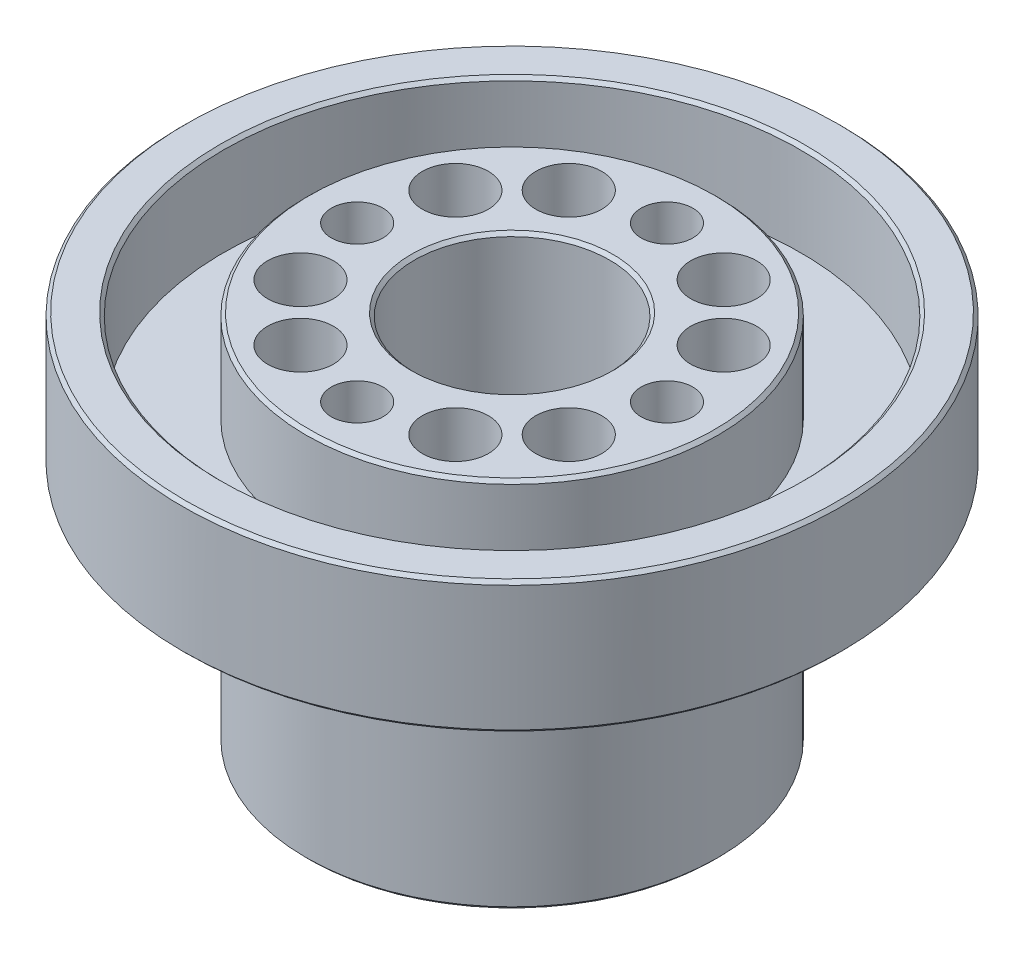
ISO-10303-21;
HEADER;
FILE_DESCRIPTION(('STEP AP214'),'2;1');
FILE_NAME('part.step','',(''),(''),'','','');
FILE_SCHEMA(('AUTOMOTIVE_DESIGN { 1 0 10303 214 1 1 1 1 }'));
ENDSEC;
DATA;
#1=APPLICATION_CONTEXT('core data for automotive mechanical design processes');
#2=APPLICATION_PROTOCOL_DEFINITION('international standard','automotive_design',2000,#1);
#3=PRODUCT_CONTEXT('',#1,'mechanical');
#4=PRODUCT('Part','Part','',(#3));
#5=PRODUCT_RELATED_PRODUCT_CATEGORY('part','',(#4));
#6=PRODUCT_DEFINITION_FORMATION('','',#4);
#7=PRODUCT_DEFINITION_CONTEXT('part definition',#1,'design');
#8=PRODUCT_DEFINITION('design','',#6,#7);
#9=PRODUCT_DEFINITION_SHAPE('','',#8);
#10=(LENGTH_UNIT() NAMED_UNIT(*) SI_UNIT(.MILLI.,.METRE.));
#11=(NAMED_UNIT(*) PLANE_ANGLE_UNIT() SI_UNIT($,.RADIAN.));
#12=(NAMED_UNIT(*) SI_UNIT($,.STERADIAN.) SOLID_ANGLE_UNIT());
#13=UNCERTAINTY_MEASURE_WITH_UNIT(LENGTH_MEASURE(1.E-05),#10,'distance_accuracy_value','');
#14=(GEOMETRIC_REPRESENTATION_CONTEXT(3) GLOBAL_UNCERTAINTY_ASSIGNED_CONTEXT((#13)) GLOBAL_UNIT_ASSIGNED_CONTEXT((#10,
#11,#12)) REPRESENTATION_CONTEXT('',''));
#15=CARTESIAN_POINT('',(0.,0.,0.));
#16=DIRECTION('',(0.,0.,1.));
#17=DIRECTION('',(1.,0.,0.));
#18=AXIS2_PLACEMENT_3D('',#15,#16,#17);
#19=CARTESIAN_POINT('',(0.,16.51,0.));
#20=DIRECTION('',(0.,1.,0.));
#21=DIRECTION('',(0.,0.,1.));
#22=AXIS2_PLACEMENT_3D('',#19,#20,#21);
#23=PLANE('',#22);
#24=CARTESIAN_POINT('',(0.,16.51,0.));
#25=DIRECTION('',(0.,1.,0.));
#26=DIRECTION('',(0.,0.,1.));
#27=AXIS2_PLACEMENT_3D('',#24,#25,#26);
#28=CIRCLE('',#27,7.5184);
#29=CARTESIAN_POINT('',(0.,16.51,7.5184));
#30=VERTEX_POINT('',#29);
#31=EDGE_CURVE('E145',#30,#30,#28,.T.);
#32=ORIENTED_EDGE('',*,*,#31,.T.);
#33=EDGE_LOOP('',(#32));
#34=FACE_BOUND('',#33,.T.);
#35=CARTESIAN_POINT('',(0.,16.51,0.));
#36=DIRECTION('',(0.,-1.,0.));
#37=DIRECTION('',(0.,0.,-1.));
#38=AXIS2_PLACEMENT_3D('',#35,#36,#37);
#39=CIRCLE('',#38,6.985);
#40=CARTESIAN_POINT('',(0.,16.51,-6.985));
#41=VERTEX_POINT('',#40);
#42=EDGE_CURVE('E18',#41,#41,#39,.T.);
#43=ORIENTED_EDGE('',*,*,#42,.T.);
#44=EDGE_LOOP('',(#43));
#45=FACE_BOUND('',#44,.T.);
#46=ADVANCED_FACE('F15',(#34,#45),#23,.T.);
#47=CARTESIAN_POINT('',(0.,28.702,0.));
#48=DIRECTION('',(0.,-1.,0.));
#49=DIRECTION('',(0.,0.,-1.));
#50=AXIS2_PLACEMENT_3D('',#47,#48,#49);
#51=CYLINDRICAL_SURFACE('',#50,6.985);
#52=CARTESIAN_POINT('',(0.,3.048,0.));
#53=DIRECTION('',(0.,-1.,0.));
#54=DIRECTION('',(0.,0.,-1.));
#55=AXIS2_PLACEMENT_3D('',#52,#53,#54);
#56=CIRCLE('',#55,6.985);
#57=CARTESIAN_POINT('',(0.,3.048,-6.985));
#58=VERTEX_POINT('',#57);
#59=EDGE_CURVE('E143',#58,#58,#56,.F.);
#60=ORIENTED_EDGE('',*,*,#59,.F.);
#61=EDGE_LOOP('',(#60));
#62=FACE_BOUND('',#61,.T.);
#63=ORIENTED_EDGE('',*,*,#42,.F.);
#64=EDGE_LOOP('',(#63));
#65=FACE_BOUND('',#64,.T.);
#66=ADVANCED_FACE('F153',(#62,#65),#51,.F.);
#67=CARTESIAN_POINT('',(0.,16.51,0.));
#68=DIRECTION('',(0.,1.,0.));
#69=DIRECTION('',(0.,0.,1.));
#70=AXIS2_PLACEMENT_3D('',#67,#68,#69);
#71=CYLINDRICAL_SURFACE('',#70,7.5184);
#72=ORIENTED_EDGE('',*,*,#31,.F.);
#73=EDGE_LOOP('',(#72));
#74=FACE_BOUND('',#73,.T.);
#75=CARTESIAN_POINT('',(0.,28.448,0.));
#76=DIRECTION('',(0.,1.,0.));
#77=DIRECTION('',(0.,0.,1.));
#78=AXIS2_PLACEMENT_3D('',#75,#76,#77);
#79=CIRCLE('',#78,7.5184);
#80=CARTESIAN_POINT('',(0.,28.448,7.5184));
#81=VERTEX_POINT('',#80);
#82=EDGE_CURVE('E142',#81,#81,#79,.T.);
#83=ORIENTED_EDGE('',*,*,#82,.T.);
#84=EDGE_LOOP('',(#83));
#85=FACE_BOUND('',#84,.T.);
#86=ADVANCED_FACE('F155',(#74,#85),#71,.F.);
#87=CARTESIAN_POINT('',(0.,21.59,0.));
#88=DIRECTION('',(0.,1.,0.));
#89=DIRECTION('',(0.,0.,1.));
#90=AXIS2_PLACEMENT_3D('',#87,#88,#89);
#91=CYLINDRICAL_SURFACE('',#90,15.875);
#92=CARTESIAN_POINT('',(0.,21.59,0.));
#93=DIRECTION('',(0.,1.,0.));
#94=DIRECTION('',(0.,0.,1.));
#95=AXIS2_PLACEMENT_3D('',#92,#93,#94);
#96=CIRCLE('',#95,15.875);
#97=CARTESIAN_POINT('',(0.,21.59,15.875));
#98=VERTEX_POINT('',#97);
#99=EDGE_CURVE('E139',#98,#98,#96,.F.);
#100=ORIENTED_EDGE('',*,*,#99,.F.);
#101=EDGE_LOOP('',(#100));
#102=FACE_BOUND('',#101,.T.);
#103=CARTESIAN_POINT('',(0.,28.448,0.));
#104=DIRECTION('',(0.,-1.,0.));
#105=DIRECTION('',(0.,0.,-1.));
#106=AXIS2_PLACEMENT_3D('',#103,#104,#105);
#107=CIRCLE('',#106,15.875);
#108=CARTESIAN_POINT('',(0.,28.448,-15.875));
#109=VERTEX_POINT('',#108);
#110=EDGE_CURVE('E30',#109,#109,#107,.F.);
#111=ORIENTED_EDGE('',*,*,#110,.F.);
#112=EDGE_LOOP('',(#111));
#113=FACE_BOUND('',#112,.T.);
#114=ADVANCED_FACE('F162',(#102,#113),#91,.T.);
#115=CARTESIAN_POINT('',(0.,3.048,0.));
#116=DIRECTION('',(0.,-1.,0.));
#117=DIRECTION('',(0.,0.,-1.));
#118=AXIS2_PLACEMENT_3D('',#115,#116,#117);
#119=PLANE('',#118);
#120=CARTESIAN_POINT('',(0.,3.048,0.));
#121=DIRECTION('',(0.,-1.,0.));
#122=DIRECTION('',(0.,0.,-1.));
#123=AXIS2_PLACEMENT_3D('',#120,#121,#122);
#124=CIRCLE('',#123,7.5184);
#125=CARTESIAN_POINT('',(0.,3.048,-7.5184));
#126=VERTEX_POINT('',#125);
#127=EDGE_CURVE('E136',#126,#126,#124,.T.);
#128=ORIENTED_EDGE('',*,*,#127,.T.);
#129=EDGE_LOOP('',(#128));
#130=FACE_BOUND('',#129,.T.);
#131=ORIENTED_EDGE('',*,*,#59,.T.);
#132=EDGE_LOOP('',(#131));
#133=FACE_BOUND('',#132,.T.);
#134=ADVANCED_FACE('F288',(#130,#133),#119,.T.);
#135=CARTESIAN_POINT('',(0.,28.448,0.));
#136=DIRECTION('',(0.,-1.,0.));
#137=DIRECTION('',(0.,0.,-1.));
#138=AXIS2_PLACEMENT_3D('',#135,#136,#137);
#139=CONICAL_SURFACE('',#138,15.875,0.785398163397448);
#140=ORIENTED_EDGE('',*,*,#110,.T.);
#141=EDGE_LOOP('',(#140));
#142=FACE_BOUND('',#141,.T.);
#143=CARTESIAN_POINT('',(0.,28.702,0.));
#144=DIRECTION('',(0.,-1.,0.));
#145=DIRECTION('',(0.,0.,-1.));
#146=AXIS2_PLACEMENT_3D('',#143,#144,#145);
#147=CIRCLE('',#146,15.621);
#148=CARTESIAN_POINT('',(0.,28.702,-15.621));
#149=VERTEX_POINT('',#148);
#150=EDGE_CURVE('E133',#149,#149,#147,.F.);
#151=ORIENTED_EDGE('',*,*,#150,.F.);
#152=EDGE_LOOP('',(#151));
#153=FACE_BOUND('',#152,.T.);
#154=ADVANCED_FACE('F284',(#142,#153),#139,.T.);
#155=CARTESIAN_POINT('',(0.,28.702,0.));
#156=DIRECTION('',(0.,1.,0.));
#157=DIRECTION('',(0.,0.,1.));
#158=AXIS2_PLACEMENT_3D('',#155,#156,#157);
#159=CONICAL_SURFACE('',#158,7.77240000000003,0.785398163397442);
#160=ORIENTED_EDGE('',*,*,#82,.F.);
#161=EDGE_LOOP('',(#160));
#162=FACE_BOUND('',#161,.T.);
#163=CARTESIAN_POINT('',(0.,28.702,0.));
#164=DIRECTION('',(0.,1.,0.));
#165=DIRECTION('',(0.,0.,1.));
#166=AXIS2_PLACEMENT_3D('',#163,#164,#165);
#167=CIRCLE('',#166,7.77240000000003);
#168=CARTESIAN_POINT('',(0.,28.702,7.77240000000003));
#169=VERTEX_POINT('',#168);
#170=EDGE_CURVE('E130',#169,#169,#167,.F.);
#171=ORIENTED_EDGE('',*,*,#170,.F.);
#172=EDGE_LOOP('',(#171));
#173=FACE_BOUND('',#172,.T.);
#174=ADVANCED_FACE('F280',(#162,#173),#159,.F.);
#175=CARTESIAN_POINT('',(0.,21.59,0.));
#176=DIRECTION('',(0.,1.,0.));
#177=DIRECTION('',(0.,0.,1.));
#178=AXIS2_PLACEMENT_3D('',#175,#176,#177);
#179=PLANE('',#178);
#180=CARTESIAN_POINT('',(0.,21.59,0.));
#181=DIRECTION('',(0.,1.,0.));
#182=DIRECTION('',(0.,0.,1.));
#183=AXIS2_PLACEMENT_3D('',#180,#181,#182);
#184=CIRCLE('',#183,22.225);
#185=CARTESIAN_POINT('',(0.,21.59,22.225));
#186=VERTEX_POINT('',#185);
#187=EDGE_CURVE('E127',#186,#186,#184,.T.);
#188=ORIENTED_EDGE('',*,*,#187,.T.);
#189=EDGE_LOOP('',(#188));
#190=FACE_BOUND('',#189,.T.);
#191=ORIENTED_EDGE('',*,*,#99,.T.);
#192=EDGE_LOOP('',(#191));
#193=FACE_BOUND('',#192,.T.);
#194=ADVANCED_FACE('F276',(#190,#193),#179,.T.);
#195=CARTESIAN_POINT('',(0.,3.048,0.));
#196=DIRECTION('',(0.,-1.,0.));
#197=DIRECTION('',(0.,0.,-1.));
#198=AXIS2_PLACEMENT_3D('',#195,#196,#197);
#199=CYLINDRICAL_SURFACE('',#198,7.5184);
#200=CARTESIAN_POINT('',(0.,0.254000000000031,0.));
#201=DIRECTION('',(0.,-1.,0.));
#202=DIRECTION('',(0.,0.,-1.));
#203=AXIS2_PLACEMENT_3D('',#200,#201,#202);
#204=CIRCLE('',#203,7.5184);
#205=CARTESIAN_POINT('',(0.,0.254000000000031,-7.5184));
#206=VERTEX_POINT('',#205);
#207=EDGE_CURVE('E102',#206,#206,#204,.T.);
#208=ORIENTED_EDGE('',*,*,#207,.T.);
#209=EDGE_LOOP('',(#208));
#210=FACE_BOUND('',#209,.T.);
#211=ORIENTED_EDGE('',*,*,#127,.F.);
#212=EDGE_LOOP('',(#211));
#213=FACE_BOUND('',#212,.T.);
#214=ADVANCED_FACE('F272',(#210,#213),#199,.F.);
#215=CARTESIAN_POINT('',(0.,28.702,0.));
#216=DIRECTION('',(0.,1.,0.));
#217=DIRECTION('',(0.,0.,1.));
#218=AXIS2_PLACEMENT_3D('',#215,#216,#217);
#219=PLANE('',#218);
#220=CARTESIAN_POINT('',(-10.3386112703787,28.702,5.96899999999994));
#221=DIRECTION('',(0.,-1.,0.));
#222=DIRECTION('',(0.,0.,-1.));
#223=AXIS2_PLACEMENT_3D('',#220,#221,#222);
#224=CIRCLE('',#223,2.54);
#225=CARTESIAN_POINT('',(-10.3386112703787,28.702,3.42899999999993));
#226=VERTEX_POINT('',#225);
#227=EDGE_CURVE('E124',#226,#226,#224,.T.);
#228=ORIENTED_EDGE('',*,*,#227,.T.);
#229=EDGE_LOOP('',(#228));
#230=FACE_BOUND('',#229,.T.);
#231=CARTESIAN_POINT('',(-5.96900000000012,28.702,10.3386112703786));
#232=DIRECTION('',(0.,-1.,0.));
#233=DIRECTION('',(0.,0.,-1.));
#234=AXIS2_PLACEMENT_3D('',#231,#232,#233);
#235=CIRCLE('',#234,2.54);
#236=CARTESIAN_POINT('',(-5.96900000000012,28.702,7.79861127037856));
#237=VERTEX_POINT('',#236);
#238=EDGE_CURVE('E121',#237,#237,#235,.T.);
#239=ORIENTED_EDGE('',*,*,#238,.T.);
#240=EDGE_LOOP('',(#239));
#241=FACE_BOUND('',#240,.T.);
#242=CARTESIAN_POINT('',(5.96900000000004,28.702,10.3386112703786));
#243=DIRECTION('',(0.,-1.,0.));
#244=DIRECTION('',(0.,0.,-1.));
#245=AXIS2_PLACEMENT_3D('',#242,#243,#244);
#246=CIRCLE('',#245,2.54);
#247=CARTESIAN_POINT('',(5.96900000000004,28.702,7.7986112703786));
#248=VERTEX_POINT('',#247);
#249=EDGE_CURVE('E118',#248,#248,#246,.T.);
#250=ORIENTED_EDGE('',*,*,#249,.T.);
#251=EDGE_LOOP('',(#250));
#252=FACE_BOUND('',#251,.T.);
#253=CARTESIAN_POINT('',(10.3386112703786,28.702,5.96900000000002));
#254=DIRECTION('',(0.,-1.,0.));
#255=DIRECTION('',(0.,0.,-1.));
#256=AXIS2_PLACEMENT_3D('',#253,#254,#255);
#257=CIRCLE('',#256,2.54);
#258=CARTESIAN_POINT('',(10.3386112703786,28.702,3.42900000000001));
#259=VERTEX_POINT('',#258);
#260=EDGE_CURVE('E115',#259,#259,#257,.T.);
#261=ORIENTED_EDGE('',*,*,#260,.T.);
#262=EDGE_LOOP('',(#261));
#263=FACE_BOUND('',#262,.T.);
#264=CARTESIAN_POINT('',(10.3386112703786,28.702,-5.96900000000001));
#265=DIRECTION('',(0.,-1.,0.));
#266=DIRECTION('',(0.,0.,-1.));
#267=AXIS2_PLACEMENT_3D('',#264,#265,#266);
#268=CIRCLE('',#267,2.54);
#269=CARTESIAN_POINT('',(10.3386112703786,28.702,-8.50900000000001));
#270=VERTEX_POINT('',#269);
#271=EDGE_CURVE('E112',#270,#270,#268,.T.);
#272=ORIENTED_EDGE('',*,*,#271,.T.);
#273=EDGE_LOOP('',(#272));
#274=FACE_BOUND('',#273,.T.);
#275=CARTESIAN_POINT('',(5.96900000000005,28.702,-10.3386112703786));
#276=DIRECTION('',(0.,-1.,0.));
#277=DIRECTION('',(0.,0.,-1.));
#278=AXIS2_PLACEMENT_3D('',#275,#276,#277);
#279=CIRCLE('',#278,2.54);
#280=CARTESIAN_POINT('',(5.96900000000005,28.702,-12.8786112703786));
#281=VERTEX_POINT('',#280);
#282=EDGE_CURVE('E109',#281,#281,#279,.T.);
#283=ORIENTED_EDGE('',*,*,#282,.T.);
#284=EDGE_LOOP('',(#283));
#285=FACE_BOUND('',#284,.T.);
#286=CARTESIAN_POINT('',(-5.96900000000004,28.702,-10.3386112703786));
#287=DIRECTION('',(0.,-1.,0.));
#288=DIRECTION('',(0.,0.,-1.));
#289=AXIS2_PLACEMENT_3D('',#286,#287,#288);
#290=CIRCLE('',#289,2.54);
#291=CARTESIAN_POINT('',(-5.96900000000004,28.702,-12.8786112703786));
#292=VERTEX_POINT('',#291);
#293=EDGE_CURVE('E106',#292,#292,#290,.T.);
#294=ORIENTED_EDGE('',*,*,#293,.T.);
#295=EDGE_LOOP('',(#294));
#296=FACE_BOUND('',#295,.T.);
#297=CARTESIAN_POINT('',(-10.3386112703786,28.702,-5.96900000000002));
#298=DIRECTION('',(0.,-1.,0.));
#299=DIRECTION('',(0.,0.,-1.));
#300=AXIS2_PLACEMENT_3D('',#297,#298,#299);
#301=CIRCLE('',#300,2.54);
#302=CARTESIAN_POINT('',(-10.3386112703786,28.702,-8.50900000000002));
#303=VERTEX_POINT('',#302);
#304=EDGE_CURVE('E103',#303,#303,#301,.T.);
#305=ORIENTED_EDGE('',*,*,#304,.T.);
#306=EDGE_LOOP('',(#305));
#307=FACE_BOUND('',#306,.T.);
#308=ORIENTED_EDGE('',*,*,#170,.T.);
#309=EDGE_LOOP('',(#308));
#310=FACE_BOUND('',#309,.T.);
#311=CARTESIAN_POINT('',(-11.938,28.702,-1.25043912669328E-13));
#312=DIRECTION('',(0.,1.,0.));
#313=DIRECTION('',(0.,0.,1.));
#314=AXIS2_PLACEMENT_3D('',#311,#312,#313);
#315=CIRCLE('',#314,1.9939);
#316=CARTESIAN_POINT('',(-11.938,28.702,1.99389999999988));
#317=VERTEX_POINT('',#316);
#318=EDGE_CURVE('E90',#317,#317,#315,.F.);
#319=ORIENTED_EDGE('',*,*,#318,.T.);
#320=EDGE_LOOP('',(#319));
#321=FACE_BOUND('',#320,.T.);
#322=CARTESIAN_POINT('',(0.,28.702,11.938));
#323=DIRECTION('',(0.,1.,0.));
#324=DIRECTION('',(0.,0.,1.));
#325=AXIS2_PLACEMENT_3D('',#322,#323,#324);
#326=CIRCLE('',#325,1.9939);
#327=CARTESIAN_POINT('',(0.,28.702,13.9319));
#328=VERTEX_POINT('',#327);
#329=EDGE_CURVE('E93',#328,#328,#326,.F.);
#330=ORIENTED_EDGE('',*,*,#329,.T.);
#331=EDGE_LOOP('',(#330));
#332=FACE_BOUND('',#331,.T.);
#333=CARTESIAN_POINT('',(11.938,28.702,0.));
#334=DIRECTION('',(0.,1.,0.));
#335=DIRECTION('',(0.,0.,1.));
#336=AXIS2_PLACEMENT_3D('',#333,#334,#335);
#337=CIRCLE('',#336,1.9939);
#338=CARTESIAN_POINT('',(11.938,28.702,1.99390000000004));
#339=VERTEX_POINT('',#338);
#340=EDGE_CURVE('E96',#339,#339,#337,.F.);
#341=ORIENTED_EDGE('',*,*,#340,.T.);
#342=EDGE_LOOP('',(#341));
#343=FACE_BOUND('',#342,.T.);
#344=CARTESIAN_POINT('',(0.,28.702,-11.938));
#345=DIRECTION('',(0.,1.,0.));
#346=DIRECTION('',(0.,0.,1.));
#347=AXIS2_PLACEMENT_3D('',#344,#345,#346);
#348=CIRCLE('',#347,1.9939);
#349=CARTESIAN_POINT('',(0.,28.702,-9.9441));
#350=VERTEX_POINT('',#349);
#351=EDGE_CURVE('E99',#350,#350,#348,.F.);
#352=ORIENTED_EDGE('',*,*,#351,.T.);
#353=EDGE_LOOP('',(#352));
#354=FACE_BOUND('',#353,.T.);
#355=ORIENTED_EDGE('',*,*,#150,.T.);
#356=EDGE_LOOP('',(#355));
#357=FACE_BOUND('',#356,.T.);
#358=ADVANCED_FACE('F268',(#230,#241,#252,#263,#274,#285,#296,#307,#310,#321,#332,#343,#354,
#357),#219,.T.);
#359=CARTESIAN_POINT('',(0.,21.59,0.));
#360=DIRECTION('',(0.,1.,0.));
#361=DIRECTION('',(0.,0.,1.));
#362=AXIS2_PLACEMENT_3D('',#359,#360,#361);
#363=CYLINDRICAL_SURFACE('',#362,22.225);
#364=ORIENTED_EDGE('',*,*,#187,.F.);
#365=EDGE_LOOP('',(#364));
#366=FACE_BOUND('',#365,.T.);
#367=CARTESIAN_POINT('',(0.,28.448,0.));
#368=DIRECTION('',(0.,1.,0.));
#369=DIRECTION('',(0.,0.,1.));
#370=AXIS2_PLACEMENT_3D('',#367,#368,#369);
#371=CIRCLE('',#370,22.225);
#372=CARTESIAN_POINT('',(0.,28.448,22.225));
#373=VERTEX_POINT('',#372);
#374=EDGE_CURVE('E89',#373,#373,#371,.T.);
#375=ORIENTED_EDGE('',*,*,#374,.T.);
#376=EDGE_LOOP('',(#375));
#377=FACE_BOUND('',#376,.T.);
#378=ADVANCED_FACE('F264',(#366,#377),#363,.F.);
#379=CARTESIAN_POINT('',(-10.3386112703787,28.702,5.96899999999994));
#380=DIRECTION('',(0.,-1.,0.));
#381=DIRECTION('',(0.,0.,-1.));
#382=AXIS2_PLACEMENT_3D('',#379,#380,#381);
#383=CYLINDRICAL_SURFACE('',#382,2.54);
#384=ORIENTED_EDGE('',*,*,#227,.F.);
#385=EDGE_LOOP('',(#384));
#386=FACE_BOUND('',#385,.T.);
#387=CARTESIAN_POINT('',(-10.3386112703787,0.,5.96899999999994));
#388=DIRECTION('',(0.,-1.,0.));
#389=DIRECTION('',(0.,0.,-1.));
#390=AXIS2_PLACEMENT_3D('',#387,#388,#389);
#391=CIRCLE('',#390,2.54);
#392=CARTESIAN_POINT('',(-10.3386112703787,0.,3.42899999999993));
#393=VERTEX_POINT('',#392);
#394=EDGE_CURVE('E86',#393,#393,#391,.T.);
#395=ORIENTED_EDGE('',*,*,#394,.T.);
#396=EDGE_LOOP('',(#395));
#397=FACE_BOUND('',#396,.T.);
#398=ADVANCED_FACE('F260',(#386,#397),#383,.F.);
#399=CARTESIAN_POINT('',(-5.96900000000012,28.702,10.3386112703786));
#400=DIRECTION('',(0.,-1.,0.));
#401=DIRECTION('',(0.,0.,-1.));
#402=AXIS2_PLACEMENT_3D('',#399,#400,#401);
#403=CYLINDRICAL_SURFACE('',#402,2.54);
#404=ORIENTED_EDGE('',*,*,#238,.F.);
#405=EDGE_LOOP('',(#404));
#406=FACE_BOUND('',#405,.T.);
#407=CARTESIAN_POINT('',(-5.96900000000012,0.,10.3386112703786));
#408=DIRECTION('',(0.,-1.,0.));
#409=DIRECTION('',(0.,0.,-1.));
#410=AXIS2_PLACEMENT_3D('',#407,#408,#409);
#411=CIRCLE('',#410,2.54);
#412=CARTESIAN_POINT('',(-5.96900000000012,0.,7.79861127037856));
#413=VERTEX_POINT('',#412);
#414=EDGE_CURVE('E83',#413,#413,#411,.T.);
#415=ORIENTED_EDGE('',*,*,#414,.T.);
#416=EDGE_LOOP('',(#415));
#417=FACE_BOUND('',#416,.T.);
#418=ADVANCED_FACE('F256',(#406,#417),#403,.F.);
#419=CARTESIAN_POINT('',(5.96900000000004,28.702,10.3386112703786));
#420=DIRECTION('',(0.,-1.,0.));
#421=DIRECTION('',(0.,0.,-1.));
#422=AXIS2_PLACEMENT_3D('',#419,#420,#421);
#423=CYLINDRICAL_SURFACE('',#422,2.54);
#424=ORIENTED_EDGE('',*,*,#249,.F.);
#425=EDGE_LOOP('',(#424));
#426=FACE_BOUND('',#425,.T.);
#427=CARTESIAN_POINT('',(5.96900000000004,0.,10.3386112703786));
#428=DIRECTION('',(0.,-1.,0.));
#429=DIRECTION('',(0.,0.,-1.));
#430=AXIS2_PLACEMENT_3D('',#427,#428,#429);
#431=CIRCLE('',#430,2.54);
#432=CARTESIAN_POINT('',(5.96900000000004,0.,7.7986112703786));
#433=VERTEX_POINT('',#432);
#434=EDGE_CURVE('E80',#433,#433,#431,.T.);
#435=ORIENTED_EDGE('',*,*,#434,.T.);
#436=EDGE_LOOP('',(#435));
#437=FACE_BOUND('',#436,.T.);
#438=ADVANCED_FACE('F252',(#426,#437),#423,.F.);
#439=CARTESIAN_POINT('',(10.3386112703786,28.702,5.96900000000002));
#440=DIRECTION('',(0.,-1.,0.));
#441=DIRECTION('',(0.,0.,-1.));
#442=AXIS2_PLACEMENT_3D('',#439,#440,#441);
#443=CYLINDRICAL_SURFACE('',#442,2.54);
#444=ORIENTED_EDGE('',*,*,#260,.F.);
#445=EDGE_LOOP('',(#444));
#446=FACE_BOUND('',#445,.T.);
#447=CARTESIAN_POINT('',(10.3386112703786,0.,5.96900000000002));
#448=DIRECTION('',(0.,-1.,0.));
#449=DIRECTION('',(0.,0.,-1.));
#450=AXIS2_PLACEMENT_3D('',#447,#448,#449);
#451=CIRCLE('',#450,2.54);
#452=CARTESIAN_POINT('',(10.3386112703786,0.,3.42900000000001));
#453=VERTEX_POINT('',#452);
#454=EDGE_CURVE('E77',#453,#453,#451,.T.);
#455=ORIENTED_EDGE('',*,*,#454,.T.);
#456=EDGE_LOOP('',(#455));
#457=FACE_BOUND('',#456,.T.);
#458=ADVANCED_FACE('F248',(#446,#457),#443,.F.);
#459=CARTESIAN_POINT('',(10.3386112703786,28.702,-5.96900000000001));
#460=DIRECTION('',(0.,-1.,0.));
#461=DIRECTION('',(0.,0.,-1.));
#462=AXIS2_PLACEMENT_3D('',#459,#460,#461);
#463=CYLINDRICAL_SURFACE('',#462,2.54);
#464=ORIENTED_EDGE('',*,*,#271,.F.);
#465=EDGE_LOOP('',(#464));
#466=FACE_BOUND('',#465,.T.);
#467=CARTESIAN_POINT('',(10.3386112703786,0.,-5.96900000000001));
#468=DIRECTION('',(0.,-1.,0.));
#469=DIRECTION('',(0.,0.,-1.));
#470=AXIS2_PLACEMENT_3D('',#467,#468,#469);
#471=CIRCLE('',#470,2.54);
#472=CARTESIAN_POINT('',(10.3386112703786,0.,-8.50900000000001));
#473=VERTEX_POINT('',#472);
#474=EDGE_CURVE('E74',#473,#473,#471,.T.);
#475=ORIENTED_EDGE('',*,*,#474,.T.);
#476=EDGE_LOOP('',(#475));
#477=FACE_BOUND('',#476,.T.);
#478=ADVANCED_FACE('F244',(#466,#477),#463,.F.);
#479=CARTESIAN_POINT('',(5.96900000000005,28.702,-10.3386112703786));
#480=DIRECTION('',(0.,-1.,0.));
#481=DIRECTION('',(0.,0.,-1.));
#482=AXIS2_PLACEMENT_3D('',#479,#480,#481);
#483=CYLINDRICAL_SURFACE('',#482,2.54);
#484=ORIENTED_EDGE('',*,*,#282,.F.);
#485=EDGE_LOOP('',(#484));
#486=FACE_BOUND('',#485,.T.);
#487=CARTESIAN_POINT('',(5.96900000000005,0.,-10.3386112703786));
#488=DIRECTION('',(0.,-1.,0.));
#489=DIRECTION('',(0.,0.,-1.));
#490=AXIS2_PLACEMENT_3D('',#487,#488,#489);
#491=CIRCLE('',#490,2.54);
#492=CARTESIAN_POINT('',(5.96900000000005,0.,-12.8786112703786));
#493=VERTEX_POINT('',#492);
#494=EDGE_CURVE('E71',#493,#493,#491,.T.);
#495=ORIENTED_EDGE('',*,*,#494,.T.);
#496=EDGE_LOOP('',(#495));
#497=FACE_BOUND('',#496,.T.);
#498=ADVANCED_FACE('F240',(#486,#497),#483,.F.);
#499=CARTESIAN_POINT('',(-5.96900000000004,28.702,-10.3386112703786));
#500=DIRECTION('',(0.,-1.,0.));
#501=DIRECTION('',(0.,0.,-1.));
#502=AXIS2_PLACEMENT_3D('',#499,#500,#501);
#503=CYLINDRICAL_SURFACE('',#502,2.54);
#504=ORIENTED_EDGE('',*,*,#293,.F.);
#505=EDGE_LOOP('',(#504));
#506=FACE_BOUND('',#505,.T.);
#507=CARTESIAN_POINT('',(-5.96900000000004,0.,-10.3386112703786));
#508=DIRECTION('',(0.,-1.,0.));
#509=DIRECTION('',(0.,0.,-1.));
#510=AXIS2_PLACEMENT_3D('',#507,#508,#509);
#511=CIRCLE('',#510,2.54);
#512=CARTESIAN_POINT('',(-5.96900000000004,0.,-12.8786112703786));
#513=VERTEX_POINT('',#512);
#514=EDGE_CURVE('E68',#513,#513,#511,.T.);
#515=ORIENTED_EDGE('',*,*,#514,.T.);
#516=EDGE_LOOP('',(#515));
#517=FACE_BOUND('',#516,.T.);
#518=ADVANCED_FACE('F236',(#506,#517),#503,.F.);
#519=CARTESIAN_POINT('',(-10.3386112703786,28.702,-5.96900000000002));
#520=DIRECTION('',(0.,-1.,0.));
#521=DIRECTION('',(0.,0.,-1.));
#522=AXIS2_PLACEMENT_3D('',#519,#520,#521);
#523=CYLINDRICAL_SURFACE('',#522,2.54);
#524=ORIENTED_EDGE('',*,*,#304,.F.);
#525=EDGE_LOOP('',(#524));
#526=FACE_BOUND('',#525,.T.);
#527=CARTESIAN_POINT('',(-10.3386112703786,0.,-5.96900000000002));
#528=DIRECTION('',(0.,-1.,0.));
#529=DIRECTION('',(0.,0.,-1.));
#530=AXIS2_PLACEMENT_3D('',#527,#528,#529);
#531=CIRCLE('',#530,2.54);
#532=CARTESIAN_POINT('',(-10.3386112703786,0.,-8.50900000000002));
#533=VERTEX_POINT('',#532);
#534=EDGE_CURVE('E65',#533,#533,#531,.T.);
#535=ORIENTED_EDGE('',*,*,#534,.T.);
#536=EDGE_LOOP('',(#535));
#537=FACE_BOUND('',#536,.T.);
#538=ADVANCED_FACE('F232',(#526,#537),#523,.F.);
#539=CARTESIAN_POINT('',(0.,0.,0.));
#540=DIRECTION('',(0.,-1.,0.));
#541=DIRECTION('',(0.,0.,-1.));
#542=AXIS2_PLACEMENT_3D('',#539,#540,#541);
#543=CONICAL_SURFACE('',#542,7.77240000000003,0.785398163397448);
#544=CARTESIAN_POINT('',(0.,0.,0.));
#545=DIRECTION('',(0.,-1.,0.));
#546=DIRECTION('',(0.,0.,-1.));
#547=AXIS2_PLACEMENT_3D('',#544,#545,#546);
#548=CIRCLE('',#547,7.77240000000003);
#549=CARTESIAN_POINT('',(0.,0.,-7.77240000000003));
#550=VERTEX_POINT('',#549);
#551=EDGE_CURVE('E62',#550,#550,#548,.T.);
#552=ORIENTED_EDGE('',*,*,#551,.T.);
#553=EDGE_LOOP('',(#552));
#554=FACE_BOUND('',#553,.T.);
#555=ORIENTED_EDGE('',*,*,#207,.F.);
#556=EDGE_LOOP('',(#555));
#557=FACE_BOUND('',#556,.T.);
#558=ADVANCED_FACE('F228',(#554,#557),#543,.F.);
#559=CARTESIAN_POINT('',(0.,0.,-11.938));
#560=DIRECTION('',(0.,1.,0.));
#561=DIRECTION('',(0.,0.,1.));
#562=AXIS2_PLACEMENT_3D('',#559,#560,#561);
#563=CYLINDRICAL_SURFACE('',#562,1.9939);
#564=CARTESIAN_POINT('',(0.,0.,-11.938));
#565=DIRECTION('',(0.,1.,0.));
#566=DIRECTION('',(0.,0.,1.));
#567=AXIS2_PLACEMENT_3D('',#564,#565,#566);
#568=CIRCLE('',#567,1.9939);
#569=CARTESIAN_POINT('',(0.,0.,-9.9441));
#570=VERTEX_POINT('',#569);
#571=EDGE_CURVE('E59',#570,#570,#568,.F.);
#572=ORIENTED_EDGE('',*,*,#571,.T.);
#573=EDGE_LOOP('',(#572));
#574=FACE_BOUND('',#573,.T.);
#575=ORIENTED_EDGE('',*,*,#351,.F.);
#576=EDGE_LOOP('',(#575));
#577=FACE_BOUND('',#576,.T.);
#578=ADVANCED_FACE('F224',(#574,#577),#563,.F.);
#579=CARTESIAN_POINT('',(11.938,0.,0.));
#580=DIRECTION('',(0.,1.,0.));
#581=DIRECTION('',(0.,0.,1.));
#582=AXIS2_PLACEMENT_3D('',#579,#580,#581);
#583=CYLINDRICAL_SURFACE('',#582,1.9939);
#584=CARTESIAN_POINT('',(11.938,0.,0.));
#585=DIRECTION('',(0.,1.,0.));
#586=DIRECTION('',(0.,0.,1.));
#587=AXIS2_PLACEMENT_3D('',#584,#585,#586);
#588=CIRCLE('',#587,1.9939);
#589=CARTESIAN_POINT('',(11.938,0.,1.99390000000004));
#590=VERTEX_POINT('',#589);
#591=EDGE_CURVE('E56',#590,#590,#588,.F.);
#592=ORIENTED_EDGE('',*,*,#591,.T.);
#593=EDGE_LOOP('',(#592));
#594=FACE_BOUND('',#593,.T.);
#595=ORIENTED_EDGE('',*,*,#340,.F.);
#596=EDGE_LOOP('',(#595));
#597=FACE_BOUND('',#596,.T.);
#598=ADVANCED_FACE('F220',(#594,#597),#583,.F.);
#599=CARTESIAN_POINT('',(0.,0.,11.938));
#600=DIRECTION('',(0.,1.,0.));
#601=DIRECTION('',(0.,0.,1.));
#602=AXIS2_PLACEMENT_3D('',#599,#600,#601);
#603=CYLINDRICAL_SURFACE('',#602,1.9939);
#604=CARTESIAN_POINT('',(0.,0.,11.938));
#605=DIRECTION('',(0.,1.,0.));
#606=DIRECTION('',(0.,0.,1.));
#607=AXIS2_PLACEMENT_3D('',#604,#605,#606);
#608=CIRCLE('',#607,1.9939);
#609=CARTESIAN_POINT('',(0.,0.,13.9319));
#610=VERTEX_POINT('',#609);
#611=EDGE_CURVE('E53',#610,#610,#608,.F.);
#612=ORIENTED_EDGE('',*,*,#611,.T.);
#613=EDGE_LOOP('',(#612));
#614=FACE_BOUND('',#613,.T.);
#615=ORIENTED_EDGE('',*,*,#329,.F.);
#616=EDGE_LOOP('',(#615));
#617=FACE_BOUND('',#616,.T.);
#618=ADVANCED_FACE('F216',(#614,#617),#603,.F.);
#619=CARTESIAN_POINT('',(-11.938,0.,-1.25043912669328E-13));
#620=DIRECTION('',(0.,1.,0.));
#621=DIRECTION('',(0.,0.,1.));
#622=AXIS2_PLACEMENT_3D('',#619,#620,#621);
#623=CYLINDRICAL_SURFACE('',#622,1.9939);
#624=CARTESIAN_POINT('',(-11.938,0.,-1.25043912669328E-13));
#625=DIRECTION('',(0.,1.,0.));
#626=DIRECTION('',(0.,0.,1.));
#627=AXIS2_PLACEMENT_3D('',#624,#625,#626);
#628=CIRCLE('',#627,1.9939);
#629=CARTESIAN_POINT('',(-11.938,0.,1.99389999999988));
#630=VERTEX_POINT('',#629);
#631=EDGE_CURVE('E50',#630,#630,#628,.F.);
#632=ORIENTED_EDGE('',*,*,#631,.T.);
#633=EDGE_LOOP('',(#632));
#634=FACE_BOUND('',#633,.T.);
#635=ORIENTED_EDGE('',*,*,#318,.F.);
#636=EDGE_LOOP('',(#635));
#637=FACE_BOUND('',#636,.T.);
#638=ADVANCED_FACE('F212',(#634,#637),#623,.F.);
#639=CARTESIAN_POINT('',(0.,28.702,0.));
#640=DIRECTION('',(0.,1.,0.));
#641=DIRECTION('',(-1.,0.,0.));
#642=AXIS2_PLACEMENT_3D('',#639,#640,#641);
#643=CONICAL_SURFACE('',#642,22.479,0.785398163397448);
#644=ORIENTED_EDGE('',*,*,#374,.F.);
#645=EDGE_LOOP('',(#644));
#646=FACE_BOUND('',#645,.T.);
#647=CARTESIAN_POINT('',(0.,28.702,0.));
#648=DIRECTION('',(0.,1.,0.));
#649=DIRECTION('',(-1.,0.,0.));
#650=AXIS2_PLACEMENT_3D('',#647,#648,#649);
#651=CIRCLE('',#650,22.479);
#652=CARTESIAN_POINT('',(-22.479,28.702,0.));
#653=VERTEX_POINT('',#652);
#654=EDGE_CURVE('E47',#653,#653,#651,.F.);
#655=ORIENTED_EDGE('',*,*,#654,.F.);
#656=EDGE_LOOP('',(#655));
#657=FACE_BOUND('',#656,.T.);
#658=ADVANCED_FACE('F208',(#646,#657),#643,.F.);
#659=CARTESIAN_POINT('',(0.,0.,0.));
#660=DIRECTION('',(0.,1.,0.));
#661=DIRECTION('',(0.,0.,1.));
#662=AXIS2_PLACEMENT_3D('',#659,#660,#661);
#663=PLANE('',#662);
#664=ORIENTED_EDGE('',*,*,#631,.F.);
#665=EDGE_LOOP('',(#664));
#666=FACE_BOUND('',#665,.T.);
#667=ORIENTED_EDGE('',*,*,#611,.F.);
#668=EDGE_LOOP('',(#667));
#669=FACE_BOUND('',#668,.T.);
#670=ORIENTED_EDGE('',*,*,#591,.F.);
#671=EDGE_LOOP('',(#670));
#672=FACE_BOUND('',#671,.T.);
#673=ORIENTED_EDGE('',*,*,#571,.F.);
#674=EDGE_LOOP('',(#673));
#675=FACE_BOUND('',#674,.T.);
#676=CARTESIAN_POINT('',(0.,0.,0.));
#677=DIRECTION('',(0.,1.,0.));
#678=DIRECTION('',(-1.,0.,0.));
#679=AXIS2_PLACEMENT_3D('',#676,#677,#678);
#680=CIRCLE('',#679,15.621);
#681=CARTESIAN_POINT('',(-15.621,0.,0.));
#682=VERTEX_POINT('',#681);
#683=EDGE_CURVE('E44',#682,#682,#680,.T.);
#684=ORIENTED_EDGE('',*,*,#683,.F.);
#685=EDGE_LOOP('',(#684));
#686=FACE_BOUND('',#685,.T.);
#687=ORIENTED_EDGE('',*,*,#551,.F.);
#688=EDGE_LOOP('',(#687));
#689=FACE_BOUND('',#688,.T.);
#690=ORIENTED_EDGE('',*,*,#534,.F.);
#691=EDGE_LOOP('',(#690));
#692=FACE_BOUND('',#691,.T.);
#693=ORIENTED_EDGE('',*,*,#514,.F.);
#694=EDGE_LOOP('',(#693));
#695=FACE_BOUND('',#694,.T.);
#696=ORIENTED_EDGE('',*,*,#494,.F.);
#697=EDGE_LOOP('',(#696));
#698=FACE_BOUND('',#697,.T.);
#699=ORIENTED_EDGE('',*,*,#474,.F.);
#700=EDGE_LOOP('',(#699));
#701=FACE_BOUND('',#700,.T.);
#702=ORIENTED_EDGE('',*,*,#454,.F.);
#703=EDGE_LOOP('',(#702));
#704=FACE_BOUND('',#703,.T.);
#705=ORIENTED_EDGE('',*,*,#434,.F.);
#706=EDGE_LOOP('',(#705));
#707=FACE_BOUND('',#706,.T.);
#708=ORIENTED_EDGE('',*,*,#414,.F.);
#709=EDGE_LOOP('',(#708));
#710=FACE_BOUND('',#709,.T.);
#711=ORIENTED_EDGE('',*,*,#394,.F.);
#712=EDGE_LOOP('',(#711));
#713=FACE_BOUND('',#712,.T.);
#714=ADVANCED_FACE('F204',(#666,#669,#672,#675,#686,#689,#692,#695,#698,#701,#704,#707,#710,
#713),#663,.F.);
#715=CARTESIAN_POINT('',(0.,28.702,0.));
#716=DIRECTION('',(0.,1.,0.));
#717=DIRECTION('',(0.,0.,1.));
#718=AXIS2_PLACEMENT_3D('',#715,#716,#717);
#719=PLANE('',#718);
#720=CARTESIAN_POINT('',(0.,28.702,0.));
#721=DIRECTION('',(0.,-1.,0.));
#722=DIRECTION('',(0.,0.,-1.));
#723=AXIS2_PLACEMENT_3D('',#720,#721,#722);
#724=CIRCLE('',#723,25.146);
#725=CARTESIAN_POINT('',(0.,28.702,-25.146));
#726=VERTEX_POINT('',#725);
#727=EDGE_CURVE('E40',#726,#726,#724,.T.);
#728=ORIENTED_EDGE('',*,*,#727,.F.);
#729=EDGE_LOOP('',(#728));
#730=FACE_BOUND('',#729,.T.);
#731=ORIENTED_EDGE('',*,*,#654,.T.);
#732=EDGE_LOOP('',(#731));
#733=FACE_BOUND('',#732,.T.);
#734=ADVANCED_FACE('F200',(#730,#733),#719,.T.);
#735=CARTESIAN_POINT('',(0.,0.254000000000001,0.));
#736=DIRECTION('',(0.,1.,0.));
#737=DIRECTION('',(-1.,0.,0.));
#738=AXIS2_PLACEMENT_3D('',#735,#736,#737);
#739=CONICAL_SURFACE('',#738,15.875,0.785398163397449);
#740=ORIENTED_EDGE('',*,*,#683,.T.);
#741=EDGE_LOOP('',(#740));
#742=FACE_BOUND('',#741,.T.);
#743=CARTESIAN_POINT('',(0.,0.254000000000004,0.));
#744=DIRECTION('',(0.,-1.,0.));
#745=DIRECTION('',(0.,0.,-1.));
#746=AXIS2_PLACEMENT_3D('',#743,#744,#745);
#747=CIRCLE('',#746,15.875);
#748=CARTESIAN_POINT('',(0.,0.254000000000004,-15.875));
#749=VERTEX_POINT('',#748);
#750=EDGE_CURVE('E43',#749,#749,#747,.F.);
#751=ORIENTED_EDGE('',*,*,#750,.F.);
#752=EDGE_LOOP('',(#751));
#753=FACE_BOUND('',#752,.T.);
#754=ADVANCED_FACE('F196',(#742,#753),#739,.T.);
#755=CARTESIAN_POINT('',(0.,28.448,0.));
#756=DIRECTION('',(0.,-1.,0.));
#757=DIRECTION('',(0.,0.,-1.));
#758=AXIS2_PLACEMENT_3D('',#755,#756,#757);
#759=CONICAL_SURFACE('',#758,25.4,0.785398163397455);
#760=CARTESIAN_POINT('',(0.,28.448,0.));
#761=DIRECTION('',(0.,-1.,0.));
#762=DIRECTION('',(0.,0.,-1.));
#763=AXIS2_PLACEMENT_3D('',#760,#761,#762);
#764=CIRCLE('',#763,25.4);
#765=CARTESIAN_POINT('',(0.,28.448,-25.4));
#766=VERTEX_POINT('',#765);
#767=EDGE_CURVE('E39',#766,#766,#764,.T.);
#768=ORIENTED_EDGE('',*,*,#767,.F.);
#769=EDGE_LOOP('',(#768));
#770=FACE_BOUND('',#769,.T.);
#771=ORIENTED_EDGE('',*,*,#727,.T.);
#772=EDGE_LOOP('',(#771));
#773=FACE_BOUND('',#772,.T.);
#774=ADVANCED_FACE('F192',(#770,#773),#759,.T.);
#775=CARTESIAN_POINT('',(0.,17.78,0.));
#776=DIRECTION('',(0.,-1.,0.));
#777=DIRECTION('',(0.,0.,-1.));
#778=AXIS2_PLACEMENT_3D('',#775,#776,#777);
#779=CYLINDRICAL_SURFACE('',#778,15.875);
#780=CARTESIAN_POINT('',(0.,17.78,0.));
#781=DIRECTION('',(0.,-1.,0.));
#782=DIRECTION('',(0.,0.,-1.));
#783=AXIS2_PLACEMENT_3D('',#780,#781,#782);
#784=CIRCLE('',#783,15.875);
#785=CARTESIAN_POINT('',(0.,17.78,-15.875));
#786=VERTEX_POINT('',#785);
#787=EDGE_CURVE('E36',#786,#786,#784,.F.);
#788=ORIENTED_EDGE('',*,*,#787,.F.);
#789=EDGE_LOOP('',(#788));
#790=FACE_BOUND('',#789,.T.);
#791=ORIENTED_EDGE('',*,*,#750,.T.);
#792=EDGE_LOOP('',(#791));
#793=FACE_BOUND('',#792,.T.);
#794=ADVANCED_FACE('F188',(#790,#793),#779,.T.);
#795=CARTESIAN_POINT('',(0.,28.702,0.));
#796=DIRECTION('',(0.,-1.,0.));
#797=DIRECTION('',(0.,0.,-1.));
#798=AXIS2_PLACEMENT_3D('',#795,#796,#797);
#799=CYLINDRICAL_SURFACE('',#798,25.4);
#800=CARTESIAN_POINT('',(0.,18.796,0.));
#801=DIRECTION('',(0.,1.,0.));
#802=DIRECTION('',(0.,0.,1.));
#803=AXIS2_PLACEMENT_3D('',#800,#801,#802);
#804=CIRCLE('',#803,25.4);
#805=CARTESIAN_POINT('',(0.,18.796,25.4));
#806=VERTEX_POINT('',#805);
#807=EDGE_CURVE('E35',#806,#806,#804,.F.);
#808=ORIENTED_EDGE('',*,*,#807,.F.);
#809=EDGE_LOOP('',(#808));
#810=FACE_BOUND('',#809,.T.);
#811=ORIENTED_EDGE('',*,*,#767,.T.);
#812=EDGE_LOOP('',(#811));
#813=FACE_BOUND('',#812,.T.);
#814=ADVANCED_FACE('F184',(#810,#813),#799,.T.);
#815=CARTESIAN_POINT('',(0.,17.78,0.));
#816=DIRECTION('',(0.,-1.,0.));
#817=DIRECTION('',(0.,0.,-1.));
#818=AXIS2_PLACEMENT_3D('',#815,#816,#817);
#819=PLANE('',#818);
#820=CARTESIAN_POINT('',(0.,17.78,0.));
#821=DIRECTION('',(0.,-1.,0.));
#822=DIRECTION('',(0.,0.,-1.));
#823=AXIS2_PLACEMENT_3D('',#820,#821,#822);
#824=CIRCLE('',#823,17.4625);
#825=CARTESIAN_POINT('',(0.,17.78,-17.4625));
#826=VERTEX_POINT('',#825);
#827=EDGE_CURVE('E27',#826,#826,#824,.F.);
#828=ORIENTED_EDGE('',*,*,#827,.F.);
#829=EDGE_LOOP('',(#828));
#830=FACE_BOUND('',#829,.T.);
#831=ORIENTED_EDGE('',*,*,#787,.T.);
#832=EDGE_LOOP('',(#831));
#833=FACE_BOUND('',#832,.T.);
#834=ADVANCED_FACE('F180',(#830,#833),#819,.T.);
#835=CARTESIAN_POINT('',(0.,18.796,0.));
#836=DIRECTION('',(0.,1.,0.));
#837=DIRECTION('',(0.,0.,1.));
#838=AXIS2_PLACEMENT_3D('',#835,#836,#837);
#839=CONICAL_SURFACE('',#838,25.4,0.785398163397455);
#840=ORIENTED_EDGE('',*,*,#807,.T.);
#841=EDGE_LOOP('',(#840));
#842=FACE_BOUND('',#841,.T.);
#843=CARTESIAN_POINT('',(0.,18.542,0.));
#844=DIRECTION('',(0.,1.,0.));
#845=DIRECTION('',(0.,0.,1.));
#846=AXIS2_PLACEMENT_3D('',#843,#844,#845);
#847=CIRCLE('',#846,25.146);
#848=CARTESIAN_POINT('',(0.,18.542,25.146));
#849=VERTEX_POINT('',#848);
#850=EDGE_CURVE('E22',#849,#849,#847,.F.);
#851=ORIENTED_EDGE('',*,*,#850,.F.);
#852=EDGE_LOOP('',(#851));
#853=FACE_BOUND('',#852,.T.);
#854=ADVANCED_FACE('F173',(#842,#853),#839,.T.);
#855=CARTESIAN_POINT('',(0.,18.542,0.));
#856=DIRECTION('',(0.,-1.,0.));
#857=DIRECTION('',(0.,0.,-1.));
#858=AXIS2_PLACEMENT_3D('',#855,#856,#857);
#859=CYLINDRICAL_SURFACE('',#858,17.4625);
#860=CARTESIAN_POINT('',(0.,18.542,0.));
#861=DIRECTION('',(0.,-1.,0.));
#862=DIRECTION('',(0.,0.,-1.));
#863=AXIS2_PLACEMENT_3D('',#860,#861,#862);
#864=CIRCLE('',#863,17.4625);
#865=CARTESIAN_POINT('',(0.,18.542,-17.4625));
#866=VERTEX_POINT('',#865);
#867=EDGE_CURVE('E10',#866,#866,#864,.F.);
#868=ORIENTED_EDGE('',*,*,#867,.F.);
#869=EDGE_LOOP('',(#868));
#870=FACE_BOUND('',#869,.T.);
#871=ORIENTED_EDGE('',*,*,#827,.T.);
#872=EDGE_LOOP('',(#871));
#873=FACE_BOUND('',#872,.T.);
#874=ADVANCED_FACE('F168',(#870,#873),#859,.T.);
#875=CARTESIAN_POINT('',(0.,18.542,0.));
#876=DIRECTION('',(0.,-1.,0.));
#877=DIRECTION('',(0.,0.,-1.));
#878=AXIS2_PLACEMENT_3D('',#875,#876,#877);
#879=PLANE('',#878);
#880=ORIENTED_EDGE('',*,*,#867,.T.);
#881=EDGE_LOOP('',(#880));
#882=FACE_BOUND('',#881,.T.);
#883=ORIENTED_EDGE('',*,*,#850,.T.);
#884=EDGE_LOOP('',(#883));
#885=FACE_BOUND('',#884,.T.);
#886=ADVANCED_FACE('F166',(#882,#885),#879,.T.);
#887=CLOSED_SHELL('',(#46,#66,#86,#114,#134,#154,#174,#194,#214,#358,#378,#398,#418,#438,#458,
#478,#498,#518,#538,#558,#578,#598,#618,#638,#658,#714,#734,#754,#774,#794,#814,#834,#854,#874,#886));
#888=MANIFOLD_SOLID_BREP('B1',#887);
#889=ADVANCED_BREP_SHAPE_REPRESENTATION('',(#18,#888),#14);
#890=SHAPE_DEFINITION_REPRESENTATION(#9,#889);
ENDSEC;
END-ISO-10303-21;
